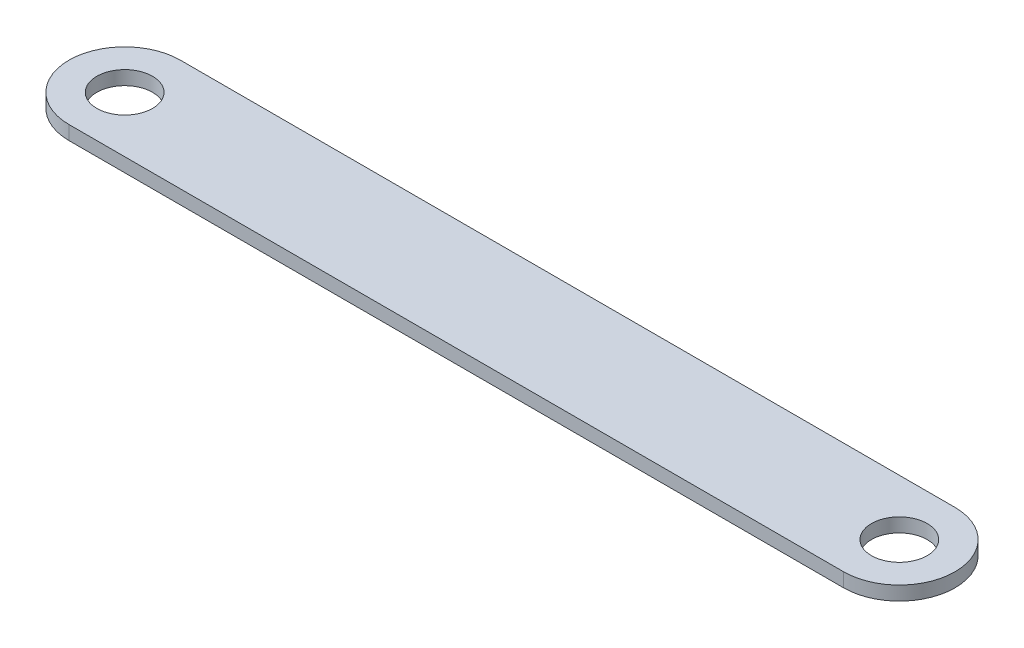
ISO-10303-21;
HEADER;
FILE_DESCRIPTION(('STEP AP214'),'2;1');
FILE_NAME('part.step','',(''),(''),'','','');
FILE_SCHEMA(('AUTOMOTIVE_DESIGN { 1 0 10303 214 1 1 1 1 }'));
ENDSEC;
DATA;
#1=APPLICATION_CONTEXT('core data for automotive mechanical design processes');
#2=APPLICATION_PROTOCOL_DEFINITION('international standard','automotive_design',2000,#1);
#3=PRODUCT_CONTEXT('',#1,'mechanical');
#4=PRODUCT('Part','Part','',(#3));
#5=PRODUCT_RELATED_PRODUCT_CATEGORY('part','',(#4));
#6=PRODUCT_DEFINITION_FORMATION('','',#4);
#7=PRODUCT_DEFINITION_CONTEXT('part definition',#1,'design');
#8=PRODUCT_DEFINITION('design','',#6,#7);
#9=PRODUCT_DEFINITION_SHAPE('','',#8);
#10=(LENGTH_UNIT() NAMED_UNIT(*) SI_UNIT(.MILLI.,.METRE.));
#11=(NAMED_UNIT(*) PLANE_ANGLE_UNIT() SI_UNIT($,.RADIAN.));
#12=(NAMED_UNIT(*) SI_UNIT($,.STERADIAN.) SOLID_ANGLE_UNIT());
#13=UNCERTAINTY_MEASURE_WITH_UNIT(LENGTH_MEASURE(1.E-05),#10,'distance_accuracy_value','');
#14=(GEOMETRIC_REPRESENTATION_CONTEXT(3) GLOBAL_UNCERTAINTY_ASSIGNED_CONTEXT((#13)) GLOBAL_UNIT_ASSIGNED_CONTEXT((#10,
#11,#12)) REPRESENTATION_CONTEXT('',''));
#15=CARTESIAN_POINT('',(0.,0.,0.));
#16=DIRECTION('',(0.,0.,1.));
#17=DIRECTION('',(1.,0.,0.));
#18=AXIS2_PLACEMENT_3D('',#15,#16,#17);
#19=CARTESIAN_POINT('',(0.,3.175,0.));
#20=DIRECTION('',(0.,1.,0.));
#21=DIRECTION('',(0.,0.,1.));
#22=AXIS2_PLACEMENT_3D('',#19,#20,#21);
#23=PLANE('',#22);
#24=CARTESIAN_POINT('',(0.,3.175,0.));
#25=DIRECTION('',(0.,1.,0.));
#26=DIRECTION('',(0.,0.,1.));
#27=AXIS2_PLACEMENT_3D('',#24,#25,#26);
#28=CIRCLE('',#27,6.35);
#29=CARTESIAN_POINT('',(0.,3.175,6.35));
#30=VERTEX_POINT('',#29);
#31=EDGE_CURVE('E101',#30,#30,#28,.T.);
#32=ORIENTED_EDGE('',*,*,#31,.F.);
#33=EDGE_LOOP('',(#32));
#34=FACE_BOUND('',#33,.T.);
#35=CARTESIAN_POINT('',(0.,3.175,0.));
#36=DIRECTION('',(0.,1.,0.));
#37=DIRECTION('',(0.,0.,1.));
#38=AXIS2_PLACEMENT_3D('',#35,#36,#37);
#39=CIRCLE('',#38,12.7);
#40=CARTESIAN_POINT('',(0.,3.175,-12.7));
#41=VERTEX_POINT('',#40);
#42=CARTESIAN_POINT('',(0.,3.175,12.7));
#43=VERTEX_POINT('',#42);
#44=EDGE_CURVE('E86',#41,#43,#39,.T.);
#45=ORIENTED_EDGE('',*,*,#44,.T.);
#46=DIRECTION('',(1.,0.,0.));
#47=VECTOR('',#46,1.);
#48=CARTESIAN_POINT('',(0.,3.175,12.7));
#49=LINE('',#48,#47);
#50=CARTESIAN_POINT('',(176.54778,3.175,12.7));
#51=VERTEX_POINT('',#50);
#52=EDGE_CURVE('E81',#43,#51,#49,.T.);
#53=ORIENTED_EDGE('',*,*,#52,.T.);
#54=CARTESIAN_POINT('',(176.54778,3.175,0.));
#55=DIRECTION('',(0.,1.,0.));
#56=DIRECTION('',(0.,0.,1.));
#57=AXIS2_PLACEMENT_3D('',#54,#55,#56);
#58=CIRCLE('',#57,12.7);
#59=CARTESIAN_POINT('',(176.54778,3.175,-12.7));
#60=VERTEX_POINT('',#59);
#61=EDGE_CURVE('E84',#51,#60,#58,.T.);
#62=ORIENTED_EDGE('',*,*,#61,.T.);
#63=DIRECTION('',(-1.,0.,0.));
#64=VECTOR('',#63,1.);
#65=CARTESIAN_POINT('',(0.,3.175,-12.7));
#66=LINE('',#65,#64);
#67=EDGE_CURVE('E51',#60,#41,#66,.T.);
#68=ORIENTED_EDGE('',*,*,#67,.T.);
#69=EDGE_LOOP('',(#45,#53,#62,#68));
#70=FACE_BOUND('',#69,.T.);
#71=CARTESIAN_POINT('',(176.54778,3.175,0.));
#72=DIRECTION('',(0.,1.,0.));
#73=DIRECTION('',(0.,0.,1.));
#74=AXIS2_PLACEMENT_3D('',#71,#72,#73);
#75=CIRCLE('',#74,6.35);
#76=CARTESIAN_POINT('',(176.54778,3.175,6.35));
#77=VERTEX_POINT('',#76);
#78=EDGE_CURVE('E116',#77,#77,#75,.T.);
#79=ORIENTED_EDGE('',*,*,#78,.F.);
#80=EDGE_LOOP('',(#79));
#81=FACE_BOUND('',#80,.T.);
#82=ADVANCED_FACE('F34',(#34,#70,#81),#23,.T.);
#83=CARTESIAN_POINT('',(0.,0.,0.));
#84=DIRECTION('',(0.,1.,0.));
#85=DIRECTION('',(0.,0.,1.));
#86=AXIS2_PLACEMENT_3D('',#83,#84,#85);
#87=PLANE('',#86);
#88=CARTESIAN_POINT('',(0.,0.,0.));
#89=DIRECTION('',(0.,1.,0.));
#90=DIRECTION('',(0.,0.,1.));
#91=AXIS2_PLACEMENT_3D('',#88,#89,#90);
#92=CIRCLE('',#91,12.7);
#93=CARTESIAN_POINT('',(0.,0.,-12.7));
#94=VERTEX_POINT('',#93);
#95=CARTESIAN_POINT('',(0.,0.,12.7));
#96=VERTEX_POINT('',#95);
#97=EDGE_CURVE('E98',#94,#96,#92,.T.);
#98=ORIENTED_EDGE('',*,*,#97,.F.);
#99=DIRECTION('',(-1.,0.,0.));
#100=VECTOR('',#99,1.);
#101=CARTESIAN_POINT('',(0.,0.,-12.7));
#102=LINE('',#101,#100);
#103=CARTESIAN_POINT('',(176.54778,0.,-12.7));
#104=VERTEX_POINT('',#103);
#105=EDGE_CURVE('E74',#104,#94,#102,.T.);
#106=ORIENTED_EDGE('',*,*,#105,.F.);
#107=CARTESIAN_POINT('',(176.54778,0.,0.));
#108=DIRECTION('',(0.,1.,0.));
#109=DIRECTION('',(0.,0.,1.));
#110=AXIS2_PLACEMENT_3D('',#107,#108,#109);
#111=CIRCLE('',#110,12.7);
#112=CARTESIAN_POINT('',(176.54778,0.,12.7));
#113=VERTEX_POINT('',#112);
#114=EDGE_CURVE('E68',#113,#104,#111,.T.);
#115=ORIENTED_EDGE('',*,*,#114,.F.);
#116=DIRECTION('',(1.,0.,0.));
#117=VECTOR('',#116,1.);
#118=CARTESIAN_POINT('',(0.,0.,12.7));
#119=LINE('',#118,#117);
#120=EDGE_CURVE('E90',#96,#113,#119,.T.);
#121=ORIENTED_EDGE('',*,*,#120,.F.);
#122=EDGE_LOOP('',(#98,#106,#115,#121));
#123=FACE_BOUND('',#122,.T.);
#124=CARTESIAN_POINT('',(0.,0.,0.));
#125=DIRECTION('',(0.,1.,0.));
#126=DIRECTION('',(0.,0.,1.));
#127=AXIS2_PLACEMENT_3D('',#124,#125,#126);
#128=CIRCLE('',#127,6.35);
#129=CARTESIAN_POINT('',(0.,0.,6.35));
#130=VERTEX_POINT('',#129);
#131=EDGE_CURVE('E113',#130,#130,#128,.T.);
#132=ORIENTED_EDGE('',*,*,#131,.T.);
#133=EDGE_LOOP('',(#132));
#134=FACE_BOUND('',#133,.T.);
#135=CARTESIAN_POINT('',(176.54778,0.,0.));
#136=DIRECTION('',(0.,1.,0.));
#137=DIRECTION('',(0.,0.,1.));
#138=AXIS2_PLACEMENT_3D('',#135,#136,#137);
#139=CIRCLE('',#138,6.35);
#140=CARTESIAN_POINT('',(176.54778,0.,6.35));
#141=VERTEX_POINT('',#140);
#142=EDGE_CURVE('E119',#141,#141,#139,.T.);
#143=ORIENTED_EDGE('',*,*,#142,.T.);
#144=EDGE_LOOP('',(#143));
#145=FACE_BOUND('',#144,.T.);
#146=ADVANCED_FACE('F109',(#123,#134,#145),#87,.F.);
#147=CARTESIAN_POINT('',(0.,3.175,0.));
#148=DIRECTION('',(0.,-1.,0.));
#149=DIRECTION('',(0.,0.,-1.));
#150=AXIS2_PLACEMENT_3D('',#147,#148,#149);
#151=CYLINDRICAL_SURFACE('',#150,12.7);
#152=ORIENTED_EDGE('',*,*,#97,.T.);
#153=DIRECTION('',(0.,-1.,0.));
#154=VECTOR('',#153,1.);
#155=CARTESIAN_POINT('',(0.,3.175,12.7));
#156=LINE('',#155,#154);
#157=EDGE_CURVE('E11',#43,#96,#156,.T.);
#158=ORIENTED_EDGE('',*,*,#157,.F.);
#159=ORIENTED_EDGE('',*,*,#44,.F.);
#160=DIRECTION('',(0.,-1.,0.));
#161=VECTOR('',#160,1.);
#162=CARTESIAN_POINT('',(0.,3.175,-12.7));
#163=LINE('',#162,#161);
#164=EDGE_CURVE('E94',#41,#94,#163,.T.);
#165=ORIENTED_EDGE('',*,*,#164,.T.);
#166=EDGE_LOOP('',(#152,#158,#159,#165));
#167=FACE_BOUND('',#166,.T.);
#168=ADVANCED_FACE('F36',(#167),#151,.T.);
#169=CARTESIAN_POINT('',(0.,3.175,12.7));
#170=DIRECTION('',(0.,0.,-1.));
#171=DIRECTION('',(-1.,0.,0.));
#172=AXIS2_PLACEMENT_3D('',#169,#170,#171);
#173=PLANE('',#172);
#174=ORIENTED_EDGE('',*,*,#120,.T.);
#175=DIRECTION('',(0.,-1.,0.));
#176=VECTOR('',#175,1.);
#177=CARTESIAN_POINT('',(176.54778,3.175,12.7));
#178=LINE('',#177,#176);
#179=EDGE_CURVE('E43',#51,#113,#178,.T.);
#180=ORIENTED_EDGE('',*,*,#179,.F.);
#181=ORIENTED_EDGE('',*,*,#52,.F.);
#182=ORIENTED_EDGE('',*,*,#157,.T.);
#183=EDGE_LOOP('',(#174,#180,#181,#182));
#184=FACE_BOUND('',#183,.T.);
#185=ADVANCED_FACE('F89',(#184),#173,.F.);
#186=CARTESIAN_POINT('',(176.54778,3.175,0.));
#187=DIRECTION('',(0.,-1.,0.));
#188=DIRECTION('',(0.,0.,-1.));
#189=AXIS2_PLACEMENT_3D('',#186,#187,#188);
#190=CYLINDRICAL_SURFACE('',#189,12.7);
#191=ORIENTED_EDGE('',*,*,#114,.T.);
#192=DIRECTION('',(0.,-1.,0.));
#193=VECTOR('',#192,1.);
#194=CARTESIAN_POINT('',(176.54778,3.175,-12.7));
#195=LINE('',#194,#193);
#196=EDGE_CURVE('E91',#60,#104,#195,.T.);
#197=ORIENTED_EDGE('',*,*,#196,.F.);
#198=ORIENTED_EDGE('',*,*,#61,.F.);
#199=ORIENTED_EDGE('',*,*,#179,.T.);
#200=EDGE_LOOP('',(#191,#197,#198,#199));
#201=FACE_BOUND('',#200,.T.);
#202=ADVANCED_FACE('F92',(#201),#190,.T.);
#203=CARTESIAN_POINT('',(0.,3.175,-12.7));
#204=DIRECTION('',(0.,0.,1.));
#205=DIRECTION('',(1.,0.,0.));
#206=AXIS2_PLACEMENT_3D('',#203,#204,#205);
#207=PLANE('',#206);
#208=ORIENTED_EDGE('',*,*,#105,.T.);
#209=ORIENTED_EDGE('',*,*,#164,.F.);
#210=ORIENTED_EDGE('',*,*,#67,.F.);
#211=ORIENTED_EDGE('',*,*,#196,.T.);
#212=EDGE_LOOP('',(#208,#209,#210,#211));
#213=FACE_BOUND('',#212,.T.);
#214=ADVANCED_FACE('F106',(#213),#207,.F.);
#215=CARTESIAN_POINT('',(0.,3.175,0.));
#216=DIRECTION('',(0.,-1.,0.));
#217=DIRECTION('',(0.,0.,-1.));
#218=AXIS2_PLACEMENT_3D('',#215,#216,#217);
#219=CYLINDRICAL_SURFACE('',#218,6.35);
#220=ORIENTED_EDGE('',*,*,#31,.T.);
#221=EDGE_LOOP('',(#220));
#222=FACE_BOUND('',#221,.T.);
#223=ORIENTED_EDGE('',*,*,#131,.F.);
#224=EDGE_LOOP('',(#223));
#225=FACE_BOUND('',#224,.T.);
#226=ADVANCED_FACE('F136',(#222,#225),#219,.F.);
#227=CARTESIAN_POINT('',(176.54778,3.175,0.));
#228=DIRECTION('',(0.,-1.,0.));
#229=DIRECTION('',(0.,0.,-1.));
#230=AXIS2_PLACEMENT_3D('',#227,#228,#229);
#231=CYLINDRICAL_SURFACE('',#230,6.35);
#232=ORIENTED_EDGE('',*,*,#78,.T.);
#233=EDGE_LOOP('',(#232));
#234=FACE_BOUND('',#233,.T.);
#235=ORIENTED_EDGE('',*,*,#142,.F.);
#236=EDGE_LOOP('',(#235));
#237=FACE_BOUND('',#236,.T.);
#238=ADVANCED_FACE('F125',(#234,#237),#231,.F.);
#239=CLOSED_SHELL('',(#82,#146,#168,#185,#202,#214,#226,#238));
#240=MANIFOLD_SOLID_BREP('B2',#239);
#241=ADVANCED_BREP_SHAPE_REPRESENTATION('',(#18,#240),#14);
#242=SHAPE_DEFINITION_REPRESENTATION(#9,#241);
ENDSEC;
END-ISO-10303-21;
